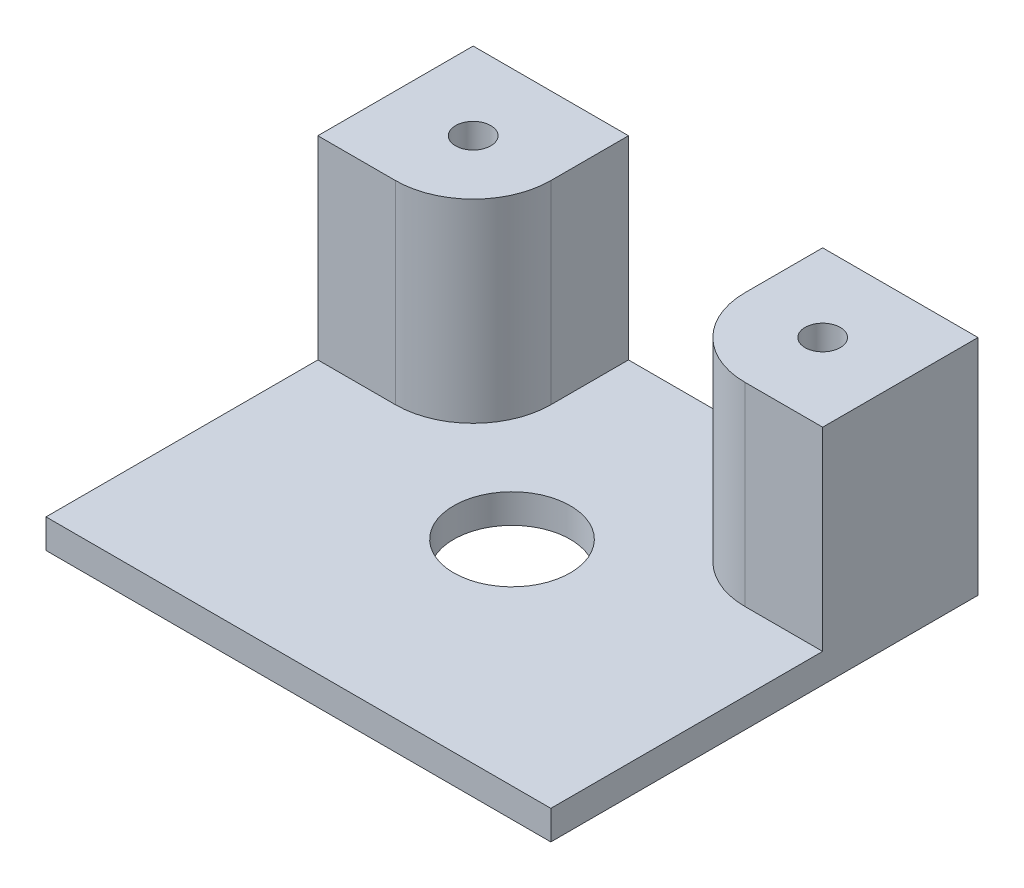
ISO-10303-21;
HEADER;
FILE_DESCRIPTION(('STEP AP214'),'2;1');
FILE_NAME('part.step','',(''),(''),'','','');
FILE_SCHEMA(('AUTOMOTIVE_DESIGN { 1 0 10303 214 1 1 1 1 }'));
ENDSEC;
DATA;
#1=APPLICATION_CONTEXT('core data for automotive mechanical design processes');
#2=APPLICATION_PROTOCOL_DEFINITION('international standard','automotive_design',2000,#1);
#3=PRODUCT_CONTEXT('',#1,'mechanical');
#4=PRODUCT('Part','Part','',(#3));
#5=PRODUCT_RELATED_PRODUCT_CATEGORY('part','',(#4));
#6=PRODUCT_DEFINITION_FORMATION('','',#4);
#7=PRODUCT_DEFINITION_CONTEXT('part definition',#1,'design');
#8=PRODUCT_DEFINITION('design','',#6,#7);
#9=PRODUCT_DEFINITION_SHAPE('','',#8);
#10=(LENGTH_UNIT() NAMED_UNIT(*) SI_UNIT(.MILLI.,.METRE.));
#11=(NAMED_UNIT(*) PLANE_ANGLE_UNIT() SI_UNIT($,.RADIAN.));
#12=(NAMED_UNIT(*) SI_UNIT($,.STERADIAN.) SOLID_ANGLE_UNIT());
#13=UNCERTAINTY_MEASURE_WITH_UNIT(LENGTH_MEASURE(1.E-05),#10,'distance_accuracy_value','');
#14=(GEOMETRIC_REPRESENTATION_CONTEXT(3) GLOBAL_UNCERTAINTY_ASSIGNED_CONTEXT((#13)) GLOBAL_UNIT_ASSIGNED_CONTEXT((#10,
#11,#12)) REPRESENTATION_CONTEXT('',''));
#15=CARTESIAN_POINT('',(0.,0.,0.));
#16=DIRECTION('',(0.,0.,1.));
#17=DIRECTION('',(1.,0.,0.));
#18=AXIS2_PLACEMENT_3D('',#15,#16,#17);
#19=CARTESIAN_POINT('',(82.5499999999692,9.525,-69.8499999999693));
#20=DIRECTION('',(0.,-1.,0.));
#21=DIRECTION('',(0.,0.,-1.));
#22=AXIS2_PLACEMENT_3D('',#19,#20,#21);
#23=PLANE('',#22);
#24=CARTESIAN_POINT('',(0.,9.525,0.));
#25=DIRECTION('',(0.,1.,0.));
#26=DIRECTION('',(0.,0.,1.));
#27=AXIS2_PLACEMENT_3D('',#24,#25,#26);
#28=CIRCLE('',#27,19.05);
#29=CARTESIAN_POINT('',(0.,9.52499999999999,19.05));
#30=VERTEX_POINT('',#29);
#31=EDGE_CURVE('E481',#30,#30,#28,.T.);
#32=ORIENTED_EDGE('',*,*,#31,.F.);
#33=EDGE_LOOP('',(#32));
#34=FACE_BOUND('',#33,.T.);
#35=DIRECTION('',(-1.,0.,0.));
#36=VECTOR('',#35,1.);
#37=CARTESIAN_POINT('',(82.5499999999693,9.525,-19.0499999999598));
#38=LINE('',#37,#36);
#39=CARTESIAN_POINT('',(82.5499999999693,9.525,-19.0499999999598));
#40=VERTEX_POINT('',#39);
#41=CARTESIAN_POINT('',(57.1499999999692,9.525,-19.0499999999598));
#42=VERTEX_POINT('',#41);
#43=EDGE_CURVE('E141',#40,#42,#38,.T.);
#44=ORIENTED_EDGE('',*,*,#43,.T.);
#45=CARTESIAN_POINT('',(57.1499999999692,9.52499999999999,-44.4499999999598));
#46=DIRECTION('',(0.,-1.,0.));
#47=DIRECTION('',(0.,0.,-1.));
#48=AXIS2_PLACEMENT_3D('',#45,#46,#47);
#49=CIRCLE('',#48,25.4);
#50=CARTESIAN_POINT('',(31.7499999999692,9.525,-44.4499999999598));
#51=VERTEX_POINT('',#50);
#52=EDGE_CURVE('E11',#42,#51,#49,.T.);
#53=ORIENTED_EDGE('',*,*,#52,.T.);
#54=DIRECTION('',(0.,0.,-1.));
#55=VECTOR('',#54,1.);
#56=CARTESIAN_POINT('',(31.7499999999692,9.525,-69.8499999999693));
#57=LINE('',#56,#55);
#58=CARTESIAN_POINT('',(31.7499999999692,9.525,-69.8499999999693));
#59=VERTEX_POINT('',#58);
#60=EDGE_CURVE('E138',#51,#59,#57,.T.);
#61=ORIENTED_EDGE('',*,*,#60,.T.);
#62=DIRECTION('',(-1.,0.,0.));
#63=VECTOR('',#62,1.);
#64=CARTESIAN_POINT('',(-82.5499999999693,9.525,-69.8499999999693));
#65=LINE('',#64,#63);
#66=CARTESIAN_POINT('',(-31.7499999999692,9.525,-69.8499999999693));
#67=VERTEX_POINT('',#66);
#68=EDGE_CURVE('E207',#59,#67,#65,.T.);
#69=ORIENTED_EDGE('',*,*,#68,.T.);
#70=DIRECTION('',(0.,0.,-1.));
#71=VECTOR('',#70,1.);
#72=CARTESIAN_POINT('',(-31.7499999999692,9.525,-69.8499999999693));
#73=LINE('',#72,#71);
#74=CARTESIAN_POINT('',(-31.7499999999692,9.525,-44.4499999999598));
#75=VERTEX_POINT('',#74);
#76=EDGE_CURVE('E177',#75,#67,#73,.T.);
#77=ORIENTED_EDGE('',*,*,#76,.F.);
#78=CARTESIAN_POINT('',(-57.1499999999692,9.52499999999999,-44.4499999999598));
#79=DIRECTION('',(0.,-1.,0.));
#80=DIRECTION('',(0.,0.,-1.));
#81=AXIS2_PLACEMENT_3D('',#78,#79,#80);
#82=CIRCLE('',#81,25.4);
#83=CARTESIAN_POINT('',(-57.1499999999692,9.525,-19.0499999999598));
#84=VERTEX_POINT('',#83);
#85=EDGE_CURVE('E204',#75,#84,#82,.T.);
#86=ORIENTED_EDGE('',*,*,#85,.T.);
#87=DIRECTION('',(1.,0.,0.));
#88=VECTOR('',#87,1.);
#89=CARTESIAN_POINT('',(-82.5499999999693,9.525,-19.0499999999598));
#90=LINE('',#89,#88);
#91=CARTESIAN_POINT('',(-82.5499999999693,9.525,-19.0499999999598));
#92=VERTEX_POINT('',#91);
#93=EDGE_CURVE('E172',#92,#84,#90,.T.);
#94=ORIENTED_EDGE('',*,*,#93,.F.);
#95=DIRECTION('',(0.,0.,1.));
#96=VECTOR('',#95,1.);
#97=CARTESIAN_POINT('',(-82.5499999999693,9.525,69.8499999999693));
#98=LINE('',#97,#96);
#99=CARTESIAN_POINT('',(-82.5499999999693,9.525,69.8499999999693));
#100=VERTEX_POINT('',#99);
#101=EDGE_CURVE('E209',#92,#100,#98,.T.);
#102=ORIENTED_EDGE('',*,*,#101,.T.);
#103=DIRECTION('',(1.,0.,0.));
#104=VECTOR('',#103,1.);
#105=CARTESIAN_POINT('',(-82.5499999999693,9.525,69.8499999999693));
#106=LINE('',#105,#104);
#107=CARTESIAN_POINT('',(82.5499999999693,9.525,69.8499999999693));
#108=VERTEX_POINT('',#107);
#109=EDGE_CURVE('E215',#100,#108,#106,.T.);
#110=ORIENTED_EDGE('',*,*,#109,.T.);
#111=DIRECTION('',(0.,0.,-1.));
#112=VECTOR('',#111,1.);
#113=CARTESIAN_POINT('',(82.5499999999693,9.525,69.8499999999693));
#114=LINE('',#113,#112);
#115=EDGE_CURVE('E188',#108,#40,#114,.T.);
#116=ORIENTED_EDGE('',*,*,#115,.T.);
#117=EDGE_LOOP('',(#44,#53,#61,#69,#77,#86,#94,#102,#110,#116));
#118=FACE_BOUND('',#117,.T.);
#119=ADVANCED_FACE('F37',(#34,#118),#23,.F.);
#120=CARTESIAN_POINT('',(82.5499999999693,9.525,69.8499999999693));
#121=DIRECTION('',(-1.,0.,0.));
#122=DIRECTION('',(0.,0.,1.));
#123=AXIS2_PLACEMENT_3D('',#120,#121,#122);
#124=PLANE('',#123);
#125=DIRECTION('',(0.,0.,-1.));
#126=VECTOR('',#125,1.);
#127=CARTESIAN_POINT('',(82.5499999999693,0.,69.8499999999693));
#128=LINE('',#127,#126);
#129=CARTESIAN_POINT('',(82.5499999999693,0.,69.8499999999693));
#130=VERTEX_POINT('',#129);
#131=CARTESIAN_POINT('',(82.5499999999693,0.,-69.8499999999693));
#132=VERTEX_POINT('',#131);
#133=EDGE_CURVE('E228',#130,#132,#128,.T.);
#134=ORIENTED_EDGE('',*,*,#133,.T.);
#135=DIRECTION('',(0.,-1.,0.));
#136=VECTOR('',#135,1.);
#137=CARTESIAN_POINT('',(82.5499999999693,9.525,-69.8499999999693));
#138=LINE('',#137,#136);
#139=CARTESIAN_POINT('',(82.5499999999693,73.025,-69.8499999999693));
#140=VERTEX_POINT('',#139);
#141=EDGE_CURVE('E200',#140,#132,#138,.T.);
#142=ORIENTED_EDGE('',*,*,#141,.F.);
#143=DIRECTION('',(0.,0.,1.));
#144=VECTOR('',#143,1.);
#145=CARTESIAN_POINT('',(82.5499999999693,73.025,-69.8499999999693));
#146=LINE('',#145,#144);
#147=CARTESIAN_POINT('',(82.5499999999693,73.025,-19.0499999999598));
#148=VERTEX_POINT('',#147);
#149=EDGE_CURVE('E148',#140,#148,#146,.T.);
#150=ORIENTED_EDGE('',*,*,#149,.T.);
#151=DIRECTION('',(0.,-1.,0.));
#152=VECTOR('',#151,1.);
#153=CARTESIAN_POINT('',(82.5499999999693,73.025,-19.0499999999598));
#154=LINE('',#153,#152);
#155=EDGE_CURVE('E158',#148,#40,#154,.T.);
#156=ORIENTED_EDGE('',*,*,#155,.T.);
#157=ORIENTED_EDGE('',*,*,#115,.F.);
#158=DIRECTION('',(0.,-1.,0.));
#159=VECTOR('',#158,1.);
#160=CARTESIAN_POINT('',(82.5499999999693,9.525,69.8499999999693));
#161=LINE('',#160,#159);
#162=EDGE_CURVE('E267',#108,#130,#161,.T.);
#163=ORIENTED_EDGE('',*,*,#162,.T.);
#164=EDGE_LOOP('',(#134,#142,#150,#156,#157,#163));
#165=FACE_BOUND('',#164,.T.);
#166=ADVANCED_FACE('F258',(#165),#124,.F.);
#167=CARTESIAN_POINT('',(-82.5499999999693,9.525,-69.8499999999693));
#168=DIRECTION('',(0.,0.,1.));
#169=DIRECTION('',(1.,0.,0.));
#170=AXIS2_PLACEMENT_3D('',#167,#168,#169);
#171=PLANE('',#170);
#172=DIRECTION('',(-1.,0.,0.));
#173=VECTOR('',#172,1.);
#174=CARTESIAN_POINT('',(-82.5499999999693,0.,-69.8499999999693));
#175=LINE('',#174,#173);
#176=CARTESIAN_POINT('',(-82.5499999999693,0.,-69.8499999999693));
#177=VERTEX_POINT('',#176);
#178=EDGE_CURVE('E263',#132,#177,#175,.T.);
#179=ORIENTED_EDGE('',*,*,#178,.T.);
#180=DIRECTION('',(0.,-1.,0.));
#181=VECTOR('',#180,1.);
#182=CARTESIAN_POINT('',(-82.5499999999693,9.525,-69.8499999999693));
#183=LINE('',#182,#181);
#184=CARTESIAN_POINT('',(-82.5499999999693,73.025,-69.8499999999693));
#185=VERTEX_POINT('',#184);
#186=EDGE_CURVE('E265',#185,#177,#183,.T.);
#187=ORIENTED_EDGE('',*,*,#186,.F.);
#188=DIRECTION('',(-1.,0.,0.));
#189=VECTOR('',#188,1.);
#190=CARTESIAN_POINT('',(-82.5499999999693,73.025,-69.8499999999693));
#191=LINE('',#190,#189);
#192=CARTESIAN_POINT('',(-31.7499999999692,73.025,-69.8499999999693));
#193=VERTEX_POINT('',#192);
#194=EDGE_CURVE('E182',#193,#185,#191,.T.);
#195=ORIENTED_EDGE('',*,*,#194,.F.);
#196=DIRECTION('',(0.,-1.,0.));
#197=VECTOR('',#196,1.);
#198=CARTESIAN_POINT('',(-31.7499999999692,73.025,-69.8499999999693));
#199=LINE('',#198,#197);
#200=EDGE_CURVE('E185',#193,#67,#199,.T.);
#201=ORIENTED_EDGE('',*,*,#200,.T.);
#202=ORIENTED_EDGE('',*,*,#68,.F.);
#203=DIRECTION('',(0.,-1.,0.));
#204=VECTOR('',#203,1.);
#205=CARTESIAN_POINT('',(31.7499999999692,73.025,-69.8499999999693));
#206=LINE('',#205,#204);
#207=CARTESIAN_POINT('',(31.7499999999692,73.025,-69.8499999999693));
#208=VERTEX_POINT('',#207);
#209=EDGE_CURVE('E163',#208,#59,#206,.T.);
#210=ORIENTED_EDGE('',*,*,#209,.F.);
#211=DIRECTION('',(1.,0.,0.));
#212=VECTOR('',#211,1.);
#213=CARTESIAN_POINT('',(82.5499999999693,73.025,-69.8499999999693));
#214=LINE('',#213,#212);
#215=EDGE_CURVE('E151',#208,#140,#214,.T.);
#216=ORIENTED_EDGE('',*,*,#215,.T.);
#217=ORIENTED_EDGE('',*,*,#141,.T.);
#218=EDGE_LOOP('',(#179,#187,#195,#201,#202,#210,#216,#217));
#219=FACE_BOUND('',#218,.T.);
#220=ADVANCED_FACE('F235',(#219),#171,.F.);
#221=CARTESIAN_POINT('',(-82.5499999999693,9.525,69.8499999999693));
#222=DIRECTION('',(1.,0.,0.));
#223=DIRECTION('',(0.,0.,-1.));
#224=AXIS2_PLACEMENT_3D('',#221,#222,#223);
#225=PLANE('',#224);
#226=DIRECTION('',(0.,0.,1.));
#227=VECTOR('',#226,1.);
#228=CARTESIAN_POINT('',(-82.5499999999693,0.,69.8499999999693));
#229=LINE('',#228,#227);
#230=CARTESIAN_POINT('',(-82.5499999999693,0.,69.8499999999693));
#231=VERTEX_POINT('',#230);
#232=EDGE_CURVE('E270',#177,#231,#229,.T.);
#233=ORIENTED_EDGE('',*,*,#232,.T.);
#234=DIRECTION('',(0.,-1.,0.));
#235=VECTOR('',#234,1.);
#236=CARTESIAN_POINT('',(-82.5499999999693,9.525,69.8499999999693));
#237=LINE('',#236,#235);
#238=EDGE_CURVE('E276',#100,#231,#237,.T.);
#239=ORIENTED_EDGE('',*,*,#238,.F.);
#240=ORIENTED_EDGE('',*,*,#101,.F.);
#241=DIRECTION('',(0.,-1.,0.));
#242=VECTOR('',#241,1.);
#243=CARTESIAN_POINT('',(-82.5499999999693,73.025,-19.0499999999598));
#244=LINE('',#243,#242);
#245=CARTESIAN_POINT('',(-82.5499999999693,73.025,-19.0499999999598));
#246=VERTEX_POINT('',#245);
#247=EDGE_CURVE('E225',#246,#92,#244,.T.);
#248=ORIENTED_EDGE('',*,*,#247,.F.);
#249=DIRECTION('',(0.,0.,1.));
#250=VECTOR('',#249,1.);
#251=CARTESIAN_POINT('',(-82.5499999999693,73.025,-69.8499999999693));
#252=LINE('',#251,#250);
#253=EDGE_CURVE('E173',#185,#246,#252,.T.);
#254=ORIENTED_EDGE('',*,*,#253,.F.);
#255=ORIENTED_EDGE('',*,*,#186,.T.);
#256=EDGE_LOOP('',(#233,#239,#240,#248,#254,#255));
#257=FACE_BOUND('',#256,.T.);
#258=ADVANCED_FACE('F281',(#257),#225,.F.);
#259=CARTESIAN_POINT('',(-82.5499999999693,9.525,69.8499999999693));
#260=DIRECTION('',(0.,0.,-1.));
#261=DIRECTION('',(-1.,0.,0.));
#262=AXIS2_PLACEMENT_3D('',#259,#260,#261);
#263=PLANE('',#262);
#264=DIRECTION('',(1.,0.,0.));
#265=VECTOR('',#264,1.);
#266=CARTESIAN_POINT('',(-82.5499999999693,0.,69.8499999999693));
#267=LINE('',#266,#265);
#268=EDGE_CURVE('E256',#231,#130,#267,.T.);
#269=ORIENTED_EDGE('',*,*,#268,.T.);
#270=ORIENTED_EDGE('',*,*,#162,.F.);
#271=ORIENTED_EDGE('',*,*,#109,.F.);
#272=ORIENTED_EDGE('',*,*,#238,.T.);
#273=EDGE_LOOP('',(#269,#270,#271,#272));
#274=FACE_BOUND('',#273,.T.);
#275=ADVANCED_FACE('F286',(#274),#263,.F.);
#276=CARTESIAN_POINT('',(82.5499999999692,0.,-69.8499999999693));
#277=DIRECTION('',(0.,-1.,0.));
#278=DIRECTION('',(0.,0.,-1.));
#279=AXIS2_PLACEMENT_3D('',#276,#277,#278);
#280=PLANE('',#279);
#281=CARTESIAN_POINT('',(0.,0.,0.));
#282=DIRECTION('',(0.,1.,0.));
#283=DIRECTION('',(0.,0.,1.));
#284=AXIS2_PLACEMENT_3D('',#281,#282,#283);
#285=CIRCLE('',#284,19.05);
#286=CARTESIAN_POINT('',(0.,0.,19.05));
#287=VERTEX_POINT('',#286);
#288=EDGE_CURVE('E144',#287,#287,#285,.T.);
#289=ORIENTED_EDGE('',*,*,#288,.T.);
#290=EDGE_LOOP('',(#289));
#291=FACE_BOUND('',#290,.T.);
#292=ORIENTED_EDGE('',*,*,#133,.F.);
#293=ORIENTED_EDGE('',*,*,#268,.F.);
#294=ORIENTED_EDGE('',*,*,#232,.F.);
#295=ORIENTED_EDGE('',*,*,#178,.F.);
#296=EDGE_LOOP('',(#292,#293,#294,#295));
#297=FACE_BOUND('',#296,.T.);
#298=ADVANCED_FACE('F284',(#291,#297),#280,.T.);
#299=CARTESIAN_POINT('',(-82.5499999999693,73.025,-19.0499999999598));
#300=DIRECTION('',(0.,0.,-1.));
#301=DIRECTION('',(-1.,0.,0.));
#302=AXIS2_PLACEMENT_3D('',#299,#300,#301);
#303=PLANE('',#302);
#304=ORIENTED_EDGE('',*,*,#93,.T.);
#305=DIRECTION('',(0.,-1.,0.));
#306=VECTOR('',#305,1.);
#307=CARTESIAN_POINT('',(-57.1499999999692,73.025,-19.0499999999598));
#308=LINE('',#307,#306);
#309=CARTESIAN_POINT('',(-57.1499999999692,73.025,-19.0499999999598));
#310=VERTEX_POINT('',#309);
#311=EDGE_CURVE('E199',#84,#310,#308,.F.);
#312=ORIENTED_EDGE('',*,*,#311,.T.);
#313=DIRECTION('',(1.,0.,0.));
#314=VECTOR('',#313,1.);
#315=CARTESIAN_POINT('',(-82.5499999999693,73.025,-19.0499999999598));
#316=LINE('',#315,#314);
#317=EDGE_CURVE('E176',#246,#310,#316,.T.);
#318=ORIENTED_EDGE('',*,*,#317,.F.);
#319=ORIENTED_EDGE('',*,*,#247,.T.);
#320=EDGE_LOOP('',(#304,#312,#318,#319));
#321=FACE_BOUND('',#320,.T.);
#322=ADVANCED_FACE('F289',(#321),#303,.F.);
#323=CARTESIAN_POINT('',(-31.7499999999692,73.025,-69.8499999999693));
#324=DIRECTION('',(-1.,0.,0.));
#325=DIRECTION('',(0.,0.,1.));
#326=AXIS2_PLACEMENT_3D('',#323,#324,#325);
#327=PLANE('',#326);
#328=DIRECTION('',(0.,0.,-1.));
#329=VECTOR('',#328,1.);
#330=CARTESIAN_POINT('',(-31.7499999999692,73.025,-69.8499999999693));
#331=LINE('',#330,#329);
#332=CARTESIAN_POINT('',(-31.7499999999692,73.025,-44.4499999999598));
#333=VERTEX_POINT('',#332);
#334=EDGE_CURVE('E180',#333,#193,#331,.T.);
#335=ORIENTED_EDGE('',*,*,#334,.F.);
#336=DIRECTION('',(0.,-1.,0.));
#337=VECTOR('',#336,1.);
#338=CARTESIAN_POINT('',(-31.7499999999692,73.025,-44.4499999999598));
#339=LINE('',#338,#337);
#340=EDGE_CURVE('E196',#333,#75,#339,.T.);
#341=ORIENTED_EDGE('',*,*,#340,.T.);
#342=ORIENTED_EDGE('',*,*,#76,.T.);
#343=ORIENTED_EDGE('',*,*,#200,.F.);
#344=EDGE_LOOP('',(#335,#341,#342,#343));
#345=FACE_BOUND('',#344,.T.);
#346=ADVANCED_FACE('F239',(#345),#327,.F.);
#347=CARTESIAN_POINT('',(-82.5499999999693,73.025,-19.0499999999598));
#348=DIRECTION('',(0.,1.,0.));
#349=DIRECTION('',(0.,0.,1.));
#350=AXIS2_PLACEMENT_3D('',#347,#348,#349);
#351=PLANE('',#350);
#352=CARTESIAN_POINT('',(-57.1499999999692,73.025,-44.4499999999645));
#353=DIRECTION('',(0.,1.,0.));
#354=DIRECTION('',(0.,0.,1.));
#355=AXIS2_PLACEMENT_3D('',#352,#353,#354);
#356=CIRCLE('',#355,5.75436999999999);
#357=CARTESIAN_POINT('',(-57.1499999999692,73.025,-38.6956299999645));
#358=VERTEX_POINT('',#357);
#359=EDGE_CURVE('E166',#358,#358,#356,.T.);
#360=ORIENTED_EDGE('',*,*,#359,.F.);
#361=EDGE_LOOP('',(#360));
#362=FACE_BOUND('',#361,.T.);
#363=ORIENTED_EDGE('',*,*,#317,.T.);
#364=CARTESIAN_POINT('',(-57.1499999999692,73.025,-44.4499999999598));
#365=DIRECTION('',(0.,1.,0.));
#366=DIRECTION('',(0.,0.,1.));
#367=AXIS2_PLACEMENT_3D('',#364,#365,#366);
#368=CIRCLE('',#367,25.4);
#369=EDGE_CURVE('E202',#310,#333,#368,.T.);
#370=ORIENTED_EDGE('',*,*,#369,.T.);
#371=ORIENTED_EDGE('',*,*,#334,.T.);
#372=ORIENTED_EDGE('',*,*,#194,.T.);
#373=ORIENTED_EDGE('',*,*,#253,.T.);
#374=EDGE_LOOP('',(#363,#370,#371,#372,#373));
#375=FACE_BOUND('',#374,.T.);
#376=ADVANCED_FACE('F293',(#362,#375),#351,.T.);
#377=CARTESIAN_POINT('',(-57.1499999999692,41.275,-44.4499999999645));
#378=DIRECTION('',(0.,1.,0.));
#379=DIRECTION('',(0.,0.,1.));
#380=AXIS2_PLACEMENT_3D('',#377,#378,#379);
#381=CONICAL_SURFACE('',#380,5.75436999999999,1.02974425867665);
#382=CARTESIAN_POINT('',(-57.1499999999692,37.8174256796864,-44.4499999999645));
#383=VERTEX_POINT('',#382);
#384=VERTEX_LOOP('',#383);
#385=FACE_BOUND('',#384,.T.);
#386=CARTESIAN_POINT('',(-57.1499999999692,41.275,-44.4499999999645));
#387=DIRECTION('',(0.,1.,0.));
#388=DIRECTION('',(0.,0.,1.));
#389=AXIS2_PLACEMENT_3D('',#386,#387,#388);
#390=CIRCLE('',#389,5.75436999999999);
#391=CARTESIAN_POINT('',(-57.1499999999692,41.275,-38.6956299999645));
#392=VERTEX_POINT('',#391);
#393=EDGE_CURVE('E169',#392,#392,#390,.T.);
#394=ORIENTED_EDGE('',*,*,#393,.T.);
#395=EDGE_LOOP('',(#394));
#396=FACE_BOUND('',#395,.T.);
#397=ADVANCED_FACE('F303',(#385,#396),#381,.F.);
#398=CARTESIAN_POINT('',(-57.1499999999692,73.025,-44.4499999999645));
#399=DIRECTION('',(0.,1.,0.));
#400=DIRECTION('',(0.,0.,1.));
#401=AXIS2_PLACEMENT_3D('',#398,#399,#400);
#402=CYLINDRICAL_SURFACE('',#401,5.75436999999999);
#403=ORIENTED_EDGE('',*,*,#393,.F.);
#404=EDGE_LOOP('',(#403));
#405=FACE_BOUND('',#404,.T.);
#406=ORIENTED_EDGE('',*,*,#359,.T.);
#407=EDGE_LOOP('',(#406));
#408=FACE_BOUND('',#407,.T.);
#409=ADVANCED_FACE('F297',(#405,#408),#402,.F.);
#410=CARTESIAN_POINT('',(-57.1499999999692,73.025,-44.4499999999598));
#411=DIRECTION('',(0.,-1.,0.));
#412=DIRECTION('',(0.,0.,-1.));
#413=AXIS2_PLACEMENT_3D('',#410,#411,#412);
#414=CYLINDRICAL_SURFACE('',#413,25.4);
#415=ORIENTED_EDGE('',*,*,#369,.F.);
#416=ORIENTED_EDGE('',*,*,#311,.F.);
#417=ORIENTED_EDGE('',*,*,#85,.F.);
#418=ORIENTED_EDGE('',*,*,#340,.F.);
#419=EDGE_LOOP('',(#415,#416,#417,#418));
#420=FACE_BOUND('',#419,.T.);
#421=ADVANCED_FACE('F295',(#420),#414,.T.);
#422=CARTESIAN_POINT('',(31.7499999999692,73.025,-69.8499999999693));
#423=DIRECTION('',(-1.,0.,0.));
#424=DIRECTION('',(0.,0.,1.));
#425=AXIS2_PLACEMENT_3D('',#422,#423,#424);
#426=PLANE('',#425);
#427=ORIENTED_EDGE('',*,*,#60,.F.);
#428=DIRECTION('',(0.,-1.,0.));
#429=VECTOR('',#428,1.);
#430=CARTESIAN_POINT('',(31.7499999999692,73.025,-44.4499999999598));
#431=LINE('',#430,#429);
#432=CARTESIAN_POINT('',(31.7499999999692,73.025,-44.4499999999598));
#433=VERTEX_POINT('',#432);
#434=EDGE_CURVE('E52',#51,#433,#431,.F.);
#435=ORIENTED_EDGE('',*,*,#434,.T.);
#436=DIRECTION('',(0.,0.,-1.));
#437=VECTOR('',#436,1.);
#438=CARTESIAN_POINT('',(31.7499999999692,73.025,-69.8499999999693));
#439=LINE('',#438,#437);
#440=EDGE_CURVE('E154',#433,#208,#439,.T.);
#441=ORIENTED_EDGE('',*,*,#440,.T.);
#442=ORIENTED_EDGE('',*,*,#209,.T.);
#443=EDGE_LOOP('',(#427,#435,#441,#442));
#444=FACE_BOUND('',#443,.T.);
#445=ADVANCED_FACE('F242',(#444),#426,.T.);
#446=CARTESIAN_POINT('',(82.5499999999693,73.025,-19.0499999999598));
#447=DIRECTION('',(0.,0.,1.));
#448=DIRECTION('',(1.,0.,0.));
#449=AXIS2_PLACEMENT_3D('',#446,#447,#448);
#450=PLANE('',#449);
#451=DIRECTION('',(-1.,0.,0.));
#452=VECTOR('',#451,1.);
#453=CARTESIAN_POINT('',(82.5499999999693,73.025,-19.0499999999598));
#454=LINE('',#453,#452);
#455=CARTESIAN_POINT('',(57.1499999999692,73.025,-19.0499999999598));
#456=VERTEX_POINT('',#455);
#457=EDGE_CURVE('E156',#148,#456,#454,.T.);
#458=ORIENTED_EDGE('',*,*,#457,.T.);
#459=DIRECTION('',(0.,-1.,0.));
#460=VECTOR('',#459,1.);
#461=CARTESIAN_POINT('',(57.1499999999692,73.025,-19.0499999999598));
#462=LINE('',#461,#460);
#463=EDGE_CURVE('E206',#456,#42,#462,.T.);
#464=ORIENTED_EDGE('',*,*,#463,.T.);
#465=ORIENTED_EDGE('',*,*,#43,.F.);
#466=ORIENTED_EDGE('',*,*,#155,.F.);
#467=EDGE_LOOP('',(#458,#464,#465,#466));
#468=FACE_BOUND('',#467,.T.);
#469=ADVANCED_FACE('F249',(#468),#450,.T.);
#470=CARTESIAN_POINT('',(82.5499999999693,73.025,-19.0499999999598));
#471=DIRECTION('',(0.,1.,0.));
#472=DIRECTION('',(0.,0.,1.));
#473=AXIS2_PLACEMENT_3D('',#470,#471,#472);
#474=PLANE('',#473);
#475=CARTESIAN_POINT('',(57.1499999999692,73.025,-44.4499999999645));
#476=DIRECTION('',(0.,1.,0.));
#477=DIRECTION('',(0.,0.,1.));
#478=AXIS2_PLACEMENT_3D('',#475,#476,#477);
#479=CIRCLE('',#478,5.75436999999999);
#480=CARTESIAN_POINT('',(57.1499999999692,73.025,-38.6956299999645));
#481=VERTEX_POINT('',#480);
#482=EDGE_CURVE('E139',#481,#481,#479,.T.);
#483=ORIENTED_EDGE('',*,*,#482,.F.);
#484=EDGE_LOOP('',(#483));
#485=FACE_BOUND('',#484,.T.);
#486=ORIENTED_EDGE('',*,*,#440,.F.);
#487=CARTESIAN_POINT('',(57.1499999999692,73.025,-44.4499999999598));
#488=DIRECTION('',(0.,1.,0.));
#489=DIRECTION('',(0.,0.,1.));
#490=AXIS2_PLACEMENT_3D('',#487,#488,#489);
#491=CIRCLE('',#490,25.4);
#492=EDGE_CURVE('E45',#433,#456,#491,.T.);
#493=ORIENTED_EDGE('',*,*,#492,.T.);
#494=ORIENTED_EDGE('',*,*,#457,.F.);
#495=ORIENTED_EDGE('',*,*,#149,.F.);
#496=ORIENTED_EDGE('',*,*,#215,.F.);
#497=EDGE_LOOP('',(#486,#493,#494,#495,#496));
#498=FACE_BOUND('',#497,.T.);
#499=ADVANCED_FACE('F132',(#485,#498),#474,.T.);
#500=CARTESIAN_POINT('',(57.1499999999692,41.275,-44.4499999999645));
#501=DIRECTION('',(0.,1.,0.));
#502=DIRECTION('',(0.,0.,1.));
#503=AXIS2_PLACEMENT_3D('',#500,#501,#502);
#504=CONICAL_SURFACE('',#503,5.75436999999999,1.02974425867665);
#505=CARTESIAN_POINT('',(57.1499999999692,37.8174256796864,-44.4499999999645));
#506=VERTEX_POINT('',#505);
#507=VERTEX_LOOP('',#506);
#508=FACE_BOUND('',#507,.T.);
#509=CARTESIAN_POINT('',(57.1499999999692,41.275,-44.4499999999645));
#510=DIRECTION('',(0.,1.,0.));
#511=DIRECTION('',(0.,0.,1.));
#512=AXIS2_PLACEMENT_3D('',#509,#510,#511);
#513=CIRCLE('',#512,5.75436999999999);
#514=CARTESIAN_POINT('',(57.1499999999692,41.275,-38.6956299999645));
#515=VERTEX_POINT('',#514);
#516=EDGE_CURVE('E136',#515,#515,#513,.T.);
#517=ORIENTED_EDGE('',*,*,#516,.T.);
#518=EDGE_LOOP('',(#517));
#519=FACE_BOUND('',#518,.T.);
#520=ADVANCED_FACE('F128',(#508,#519),#504,.F.);
#521=CARTESIAN_POINT('',(57.1499999999692,73.025,-44.4499999999645));
#522=DIRECTION('',(0.,1.,0.));
#523=DIRECTION('',(0.,0.,1.));
#524=AXIS2_PLACEMENT_3D('',#521,#522,#523);
#525=CYLINDRICAL_SURFACE('',#524,5.75436999999999);
#526=ORIENTED_EDGE('',*,*,#516,.F.);
#527=EDGE_LOOP('',(#526));
#528=FACE_BOUND('',#527,.T.);
#529=ORIENTED_EDGE('',*,*,#482,.T.);
#530=EDGE_LOOP('',(#529));
#531=FACE_BOUND('',#530,.T.);
#532=ADVANCED_FACE('F131',(#528,#531),#525,.F.);
#533=CARTESIAN_POINT('',(57.1499999999692,73.025,-44.4499999999598));
#534=DIRECTION('',(0.,-1.,0.));
#535=DIRECTION('',(0.,0.,-1.));
#536=AXIS2_PLACEMENT_3D('',#533,#534,#535);
#537=CYLINDRICAL_SURFACE('',#536,25.4);
#538=ORIENTED_EDGE('',*,*,#492,.F.);
#539=ORIENTED_EDGE('',*,*,#434,.F.);
#540=ORIENTED_EDGE('',*,*,#52,.F.);
#541=ORIENTED_EDGE('',*,*,#463,.F.);
#542=EDGE_LOOP('',(#538,#539,#540,#541));
#543=FACE_BOUND('',#542,.T.);
#544=ADVANCED_FACE('F39',(#543),#537,.T.);
#545=CARTESIAN_POINT('',(0.,0.,0.));
#546=DIRECTION('',(0.,1.,0.));
#547=DIRECTION('',(0.,0.,1.));
#548=AXIS2_PLACEMENT_3D('',#545,#546,#547);
#549=CYLINDRICAL_SURFACE('',#548,19.05);
#550=CARTESIAN_POINT('',(0.,0.,19.05));
#551=CARTESIAN_POINT('',(0.,0.0992187499999998,19.05));
#552=CARTESIAN_POINT('',(0.,0.1984375,19.05));
#553=CARTESIAN_POINT('',(0.,0.396875,19.05));
#554=CARTESIAN_POINT('',(0.,0.49609375,19.05));
#555=CARTESIAN_POINT('',(0.,0.694531249999999,19.05));
#556=CARTESIAN_POINT('',(0.,0.79375,19.05));
#557=CARTESIAN_POINT('',(0.,0.992187499999999,19.05));
#558=CARTESIAN_POINT('',(0.,1.09140625,19.05));
#559=CARTESIAN_POINT('',(0.,1.28984375,19.05));
#560=CARTESIAN_POINT('',(0.,1.3890625,19.05));
#561=CARTESIAN_POINT('',(0.,1.5875,19.05));
#562=CARTESIAN_POINT('',(0.,1.68671875,19.05));
#563=CARTESIAN_POINT('',(0.,1.88515625,19.05));
#564=CARTESIAN_POINT('',(0.,1.984375,19.05));
#565=CARTESIAN_POINT('',(0.,2.1828125,19.05));
#566=CARTESIAN_POINT('',(0.,2.28203125,19.05));
#567=CARTESIAN_POINT('',(0.,2.48046875,19.05));
#568=CARTESIAN_POINT('',(0.,2.5796875,19.05));
#569=CARTESIAN_POINT('',(0.,2.778125,19.05));
#570=CARTESIAN_POINT('',(0.,2.87734375,19.05));
#571=CARTESIAN_POINT('',(0.,3.07578125,19.05));
#572=CARTESIAN_POINT('',(0.,3.175,19.05));
#573=CARTESIAN_POINT('',(0.,3.3734375,19.05));
#574=CARTESIAN_POINT('',(0.,3.47265625,19.05));
#575=CARTESIAN_POINT('',(0.,3.67109375,19.05));
#576=CARTESIAN_POINT('',(0.,3.7703125,19.05));
#577=CARTESIAN_POINT('',(0.,3.96875,19.05));
#578=CARTESIAN_POINT('',(0.,4.06796875,19.05));
#579=CARTESIAN_POINT('',(0.,4.26640625,19.05));
#580=CARTESIAN_POINT('',(0.,4.365625,19.05));
#581=CARTESIAN_POINT('',(0.,4.5640625,19.05));
#582=CARTESIAN_POINT('',(0.,4.66328125,19.05));
#583=CARTESIAN_POINT('',(0.,4.86171875,19.05));
#584=CARTESIAN_POINT('',(0.,4.9609375,19.05));
#585=CARTESIAN_POINT('',(0.,5.159375,19.05));
#586=CARTESIAN_POINT('',(0.,5.25859375,19.05));
#587=CARTESIAN_POINT('',(0.,5.45703125,19.05));
#588=CARTESIAN_POINT('',(0.,5.55625,19.05));
#589=CARTESIAN_POINT('',(0.,5.7546875,19.05));
#590=CARTESIAN_POINT('',(0.,5.85390625,19.05));
#591=CARTESIAN_POINT('',(0.,6.05234375,19.05));
#592=CARTESIAN_POINT('',(0.,6.1515625,19.05));
#593=CARTESIAN_POINT('',(0.,6.35,19.05));
#594=CARTESIAN_POINT('',(0.,6.44921875,19.05));
#595=CARTESIAN_POINT('',(0.,6.64765625,19.05));
#596=CARTESIAN_POINT('',(0.,6.746875,19.05));
#597=CARTESIAN_POINT('',(0.,6.9453125,19.05));
#598=CARTESIAN_POINT('',(0.,7.04453125,19.05));
#599=CARTESIAN_POINT('',(0.,7.24296875,19.05));
#600=CARTESIAN_POINT('',(0.,7.3421875,19.05));
#601=CARTESIAN_POINT('',(0.,7.540625,19.05));
#602=CARTESIAN_POINT('',(0.,7.63984375,19.05));
#603=CARTESIAN_POINT('',(0.,7.83828125,19.05));
#604=CARTESIAN_POINT('',(0.,7.93749999999999,19.05));
#605=CARTESIAN_POINT('',(0.,8.13593749999999,19.05));
#606=CARTESIAN_POINT('',(0.,8.23515625,19.05));
#607=CARTESIAN_POINT('',(0.,8.43359374999999,19.05));
#608=CARTESIAN_POINT('',(0.,8.5328125,19.05));
#609=CARTESIAN_POINT('',(0.,8.73124999999999,19.05));
#610=CARTESIAN_POINT('',(0.,8.83046874999999,19.05));
#611=CARTESIAN_POINT('',(0.,9.02890624999999,19.05));
#612=CARTESIAN_POINT('',(0.,9.12812499999999,19.05));
#613=CARTESIAN_POINT('',(0.,9.32656249999999,19.05));
#614=CARTESIAN_POINT('',(0.,9.42578124999999,19.05));
#615=CARTESIAN_POINT('',(0.,9.52499999999999,19.05));
#616=B_SPLINE_CURVE_WITH_KNOTS('',3,(#550,#551,#552,#553,#554,#555,#556,#557,#558,#559,#560,
#561,#562,#563,#564,#565,#566,#567,#568,#569,#570,#571,#572,#573,#574,#575,#576,#577,#578,#579,
#580,#581,#582,#583,#584,#585,#586,#587,#588,#589,#590,#591,#592,#593,#594,#595,#596,#597,#598,
#599,#600,#601,#602,#603,#604,#605,#606,#607,#608,#609,#610,#611,#612,#613,#614,#615),
.UNSPECIFIED.,.F.,.F.,(4,2,2,2,2,2,2,2,2,2,2,2,2,2,2,2,2,2,2,2,2,2,2,2,2,2,2,2,2,2,2,2,4),(0.,
0.29765625,0.5953125,0.892968749999999,1.190625,1.48828125,1.7859375,2.08359375,2.38125,
2.67890625,2.9765625,3.27421875,3.571875,3.86953125,4.1671875,4.46484375,4.7625,5.06015625,
5.3578125,5.65546875,5.953125,6.25078125,6.5484375,6.84609375,7.14375,7.44140625,
7.73906249999999,8.03671875,8.33437499999999,8.63203125,8.92968749999999,9.22734374999999,
9.52499999999999),.UNSPECIFIED.);
#617=EDGE_CURVE('BSEAM392',#287,#30,#616,.T.);
#618=ORIENTED_EDGE('',*,*,#288,.F.);
#619=ORIENTED_EDGE('',*,*,#31,.T.);
#620=ORIENTED_EDGE('',*,*,#617,.T.);
#621=ORIENTED_EDGE('',*,*,#617,.F.);
#622=EDGE_LOOP('',(#618,#620,#619,#621));
#623=FACE_BOUND('',#622,.T.);
#624=ADVANCED_FACE('F392',(#623),#549,.F.);
#625=CLOSED_SHELL('',(#119,#166,#220,#258,#275,#298,#322,#346,#376,#397,#409,#421,#445,#469,
#499,#520,#532,#544,#624));
#626=MANIFOLD_SOLID_BREP('B2',#625);
#627=ADVANCED_BREP_SHAPE_REPRESENTATION('',(#18,#626),#14);
#628=SHAPE_DEFINITION_REPRESENTATION(#9,#627);
ENDSEC;
END-ISO-10303-21;
